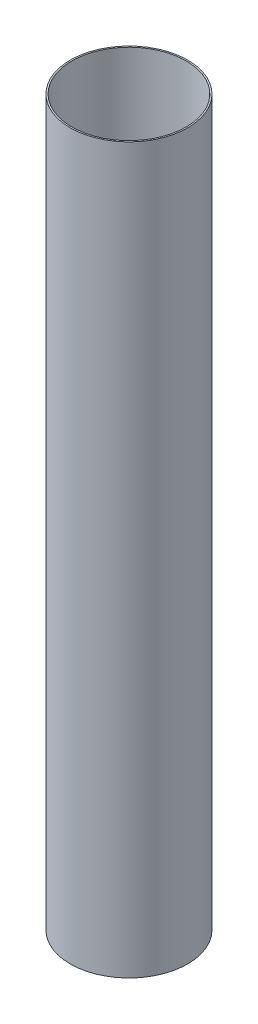
ISO-10303-21;
HEADER;
FILE_DESCRIPTION(('STEP AP214'),'2;1');
FILE_NAME('part.step','',(''),(''),'','','');
FILE_SCHEMA(('AUTOMOTIVE_DESIGN { 1 0 10303 214 1 1 1 1 }'));
ENDSEC;
DATA;
#1=APPLICATION_CONTEXT('core data for automotive mechanical design processes');
#2=APPLICATION_PROTOCOL_DEFINITION('international standard','automotive_design',2000,#1);
#3=PRODUCT_CONTEXT('',#1,'mechanical');
#4=PRODUCT('Part','Part','',(#3));
#5=PRODUCT_RELATED_PRODUCT_CATEGORY('part','',(#4));
#6=PRODUCT_DEFINITION_FORMATION('','',#4);
#7=PRODUCT_DEFINITION_CONTEXT('part definition',#1,'design');
#8=PRODUCT_DEFINITION('design','',#6,#7);
#9=PRODUCT_DEFINITION_SHAPE('','',#8);
#10=(LENGTH_UNIT() NAMED_UNIT(*) SI_UNIT(.MILLI.,.METRE.));
#11=(NAMED_UNIT(*) PLANE_ANGLE_UNIT() SI_UNIT($,.RADIAN.));
#12=(NAMED_UNIT(*) SI_UNIT($,.STERADIAN.) SOLID_ANGLE_UNIT());
#13=UNCERTAINTY_MEASURE_WITH_UNIT(LENGTH_MEASURE(1.E-05),#10,'distance_accuracy_value','');
#14=(GEOMETRIC_REPRESENTATION_CONTEXT(3) GLOBAL_UNCERTAINTY_ASSIGNED_CONTEXT((#13)) GLOBAL_UNIT_ASSIGNED_CONTEXT((#10,
#11,#12)) REPRESENTATION_CONTEXT('',''));
#15=CARTESIAN_POINT('',(0.,0.,0.));
#16=DIRECTION('',(0.,0.,1.));
#17=DIRECTION('',(1.,0.,0.));
#18=AXIS2_PLACEMENT_3D('',#15,#16,#17);
#19=CARTESIAN_POINT('',(0.,370.,0.));
#20=DIRECTION('',(0.,1.,0.));
#21=DIRECTION('',(0.,0.,1.));
#22=AXIS2_PLACEMENT_3D('',#19,#20,#21);
#23=PLANE('',#22);
#24=CARTESIAN_POINT('',(0.,370.,0.));
#25=DIRECTION('',(0.,1.,0.));
#26=DIRECTION('',(0.,0.,1.));
#27=AXIS2_PLACEMENT_3D('',#24,#25,#26);
#28=CIRCLE('',#27,60.);
#29=CARTESIAN_POINT('',(0.,370.,60.));
#30=VERTEX_POINT('',#29);
#31=EDGE_CURVE('E11',#30,#30,#28,.T.);
#32=ORIENTED_EDGE('',*,*,#31,.T.);
#33=EDGE_LOOP('',(#32));
#34=FACE_BOUND('',#33,.T.);
#35=CARTESIAN_POINT('',(0.,370.,0.));
#36=DIRECTION('',(0.,1.,0.));
#37=DIRECTION('',(1.,0.,0.));
#38=AXIS2_PLACEMENT_3D('',#35,#36,#37);
#39=CIRCLE('',#38,58.5);
#40=CARTESIAN_POINT('',(58.5,370.,0.));
#41=VERTEX_POINT('',#40);
#42=EDGE_CURVE('E50',#41,#41,#39,.T.);
#43=ORIENTED_EDGE('',*,*,#42,.F.);
#44=EDGE_LOOP('',(#43));
#45=FACE_BOUND('',#44,.T.);
#46=ADVANCED_FACE('F39',(#34,#45),#23,.T.);
#47=CARTESIAN_POINT('',(0.,-370.,0.));
#48=DIRECTION('',(0.,1.,0.));
#49=DIRECTION('',(0.,0.,1.));
#50=AXIS2_PLACEMENT_3D('',#47,#48,#49);
#51=PLANE('',#50);
#52=CARTESIAN_POINT('',(0.,-370.,0.));
#53=DIRECTION('',(0.,1.,0.));
#54=DIRECTION('',(0.,0.,1.));
#55=AXIS2_PLACEMENT_3D('',#52,#53,#54);
#56=CIRCLE('',#55,60.);
#57=CARTESIAN_POINT('',(0.,-370.,60.));
#58=VERTEX_POINT('',#57);
#59=EDGE_CURVE('E43',#58,#58,#56,.T.);
#60=ORIENTED_EDGE('',*,*,#59,.F.);
#61=EDGE_LOOP('',(#60));
#62=FACE_BOUND('',#61,.T.);
#63=CARTESIAN_POINT('',(0.,-370.,0.));
#64=DIRECTION('',(0.,1.,0.));
#65=DIRECTION('',(1.,0.,0.));
#66=AXIS2_PLACEMENT_3D('',#63,#64,#65);
#67=CIRCLE('',#66,58.5);
#68=CARTESIAN_POINT('',(58.5,-370.,0.));
#69=VERTEX_POINT('',#68);
#70=EDGE_CURVE('E52',#69,#69,#67,.T.);
#71=ORIENTED_EDGE('',*,*,#70,.T.);
#72=EDGE_LOOP('',(#71));
#73=FACE_BOUND('',#72,.T.);
#74=ADVANCED_FACE('F62',(#62,#73),#51,.F.);
#75=CARTESIAN_POINT('',(0.,370.,0.));
#76=DIRECTION('',(0.,-1.,0.));
#77=DIRECTION('',(0.,0.,-1.));
#78=AXIS2_PLACEMENT_3D('',#75,#76,#77);
#79=CYLINDRICAL_SURFACE('',#78,60.);
#80=ORIENTED_EDGE('',*,*,#31,.F.);
#81=EDGE_LOOP('',(#80));
#82=FACE_BOUND('',#81,.T.);
#83=ORIENTED_EDGE('',*,*,#59,.T.);
#84=EDGE_LOOP('',(#83));
#85=FACE_BOUND('',#84,.T.);
#86=ADVANCED_FACE('F41',(#82,#85),#79,.T.);
#87=CARTESIAN_POINT('',(0.,370.,0.));
#88=DIRECTION('',(0.,-1.,0.));
#89=DIRECTION('',(0.,0.,-1.));
#90=AXIS2_PLACEMENT_3D('',#87,#88,#89);
#91=CYLINDRICAL_SURFACE('',#90,58.5);
#92=ORIENTED_EDGE('',*,*,#42,.T.);
#93=EDGE_LOOP('',(#92));
#94=FACE_BOUND('',#93,.T.);
#95=ORIENTED_EDGE('',*,*,#70,.F.);
#96=EDGE_LOOP('',(#95));
#97=FACE_BOUND('',#96,.T.);
#98=ADVANCED_FACE('F58',(#94,#97),#91,.F.);
#99=CLOSED_SHELL('',(#46,#74,#86,#98));
#100=MANIFOLD_SOLID_BREP('B2',#99);
#101=ADVANCED_BREP_SHAPE_REPRESENTATION('',(#18,#100),#14);
#102=SHAPE_DEFINITION_REPRESENTATION(#9,#101);
ENDSEC;
END-ISO-10303-21;
